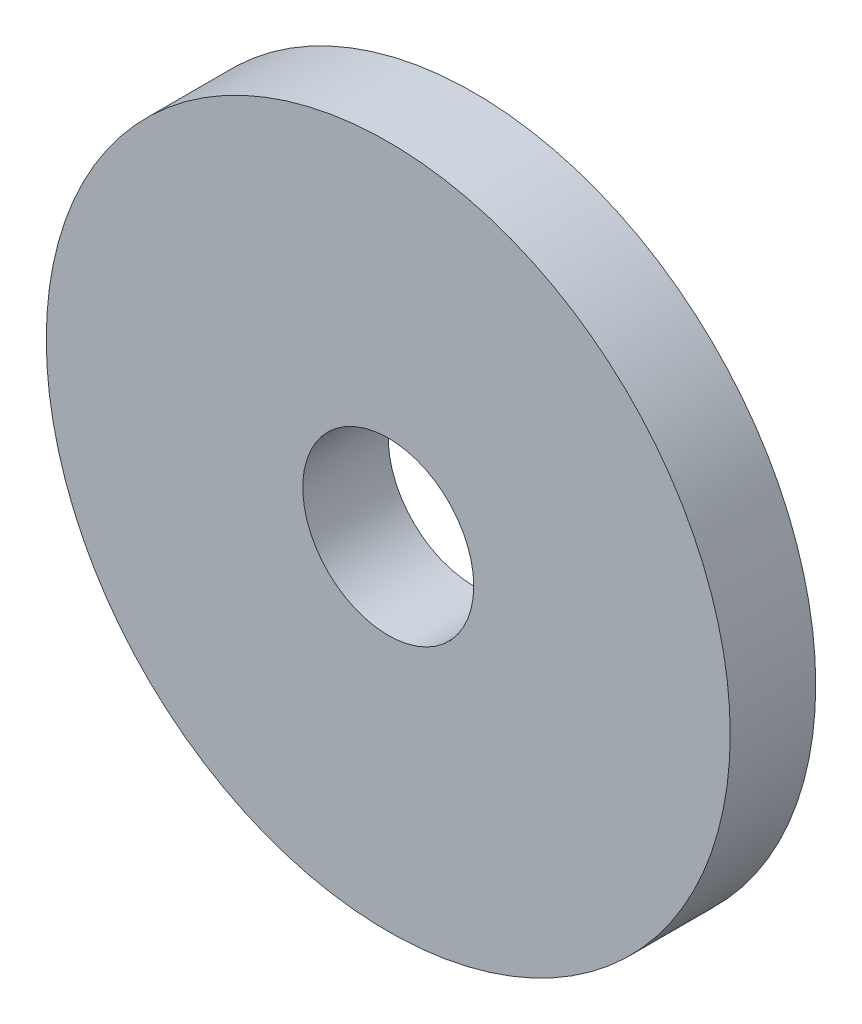
ISO-10303-21;
HEADER;
FILE_DESCRIPTION(('STEP AP214'),'2;1');
FILE_NAME('part.step','',(''),(''),'','','');
FILE_SCHEMA(('AUTOMOTIVE_DESIGN { 1 0 10303 214 1 1 1 1 }'));
ENDSEC;
DATA;
#1=APPLICATION_CONTEXT('core data for automotive mechanical design processes');
#2=APPLICATION_PROTOCOL_DEFINITION('international standard','automotive_design',2000,#1);
#3=PRODUCT_CONTEXT('',#1,'mechanical');
#4=PRODUCT('Part','Part','',(#3));
#5=PRODUCT_RELATED_PRODUCT_CATEGORY('part','',(#4));
#6=PRODUCT_DEFINITION_FORMATION('','',#4);
#7=PRODUCT_DEFINITION_CONTEXT('part definition',#1,'design');
#8=PRODUCT_DEFINITION('design','',#6,#7);
#9=PRODUCT_DEFINITION_SHAPE('','',#8);
#10=(LENGTH_UNIT() NAMED_UNIT(*) SI_UNIT(.MILLI.,.METRE.));
#11=(NAMED_UNIT(*) PLANE_ANGLE_UNIT() SI_UNIT($,.RADIAN.));
#12=(NAMED_UNIT(*) SI_UNIT($,.STERADIAN.) SOLID_ANGLE_UNIT());
#13=UNCERTAINTY_MEASURE_WITH_UNIT(LENGTH_MEASURE(1.E-05),#10,'distance_accuracy_value','');
#14=(GEOMETRIC_REPRESENTATION_CONTEXT(3) GLOBAL_UNCERTAINTY_ASSIGNED_CONTEXT((#13)) GLOBAL_UNIT_ASSIGNED_CONTEXT((#10,
#11,#12)) REPRESENTATION_CONTEXT('',''));
#15=CARTESIAN_POINT('',(0.,0.,0.));
#16=DIRECTION('',(0.,0.,1.));
#17=DIRECTION('',(1.,0.,0.));
#18=AXIS2_PLACEMENT_3D('',#15,#16,#17);
#19=CARTESIAN_POINT('',(0.,0.,5.));
#20=DIRECTION('',(0.,0.,-1.));
#21=DIRECTION('',(-1.,0.,0.));
#22=AXIS2_PLACEMENT_3D('',#19,#20,#21);
#23=CYLINDRICAL_SURFACE('',#22,20.);
#24=CARTESIAN_POINT('',(0.,0.,5.));
#25=DIRECTION('',(0.,0.,1.));
#26=DIRECTION('',(1.,0.,0.));
#27=AXIS2_PLACEMENT_3D('',#24,#25,#26);
#28=CIRCLE('',#27,20.);
#29=CARTESIAN_POINT('',(20.,0.,5.));
#30=VERTEX_POINT('',#29);
#31=EDGE_CURVE('E10',#30,#30,#28,.T.);
#32=ORIENTED_EDGE('',*,*,#31,.F.);
#33=EDGE_LOOP('',(#32));
#34=FACE_BOUND('',#33,.T.);
#35=CARTESIAN_POINT('',(0.,0.,0.));
#36=DIRECTION('',(0.,0.,1.));
#37=DIRECTION('',(1.,0.,0.));
#38=AXIS2_PLACEMENT_3D('',#35,#36,#37);
#39=CIRCLE('',#38,20.);
#40=CARTESIAN_POINT('',(20.,0.,0.));
#41=VERTEX_POINT('',#40);
#42=EDGE_CURVE('E36',#41,#41,#39,.T.);
#43=ORIENTED_EDGE('',*,*,#42,.T.);
#44=EDGE_LOOP('',(#43));
#45=FACE_BOUND('',#44,.T.);
#46=ADVANCED_FACE('F33',(#34,#45),#23,.T.);
#47=CARTESIAN_POINT('',(0.,0.,5.));
#48=DIRECTION('',(0.,0.,1.));
#49=DIRECTION('',(1.,0.,0.));
#50=AXIS2_PLACEMENT_3D('',#47,#48,#49);
#51=PLANE('',#50);
#52=CARTESIAN_POINT('',(0.,0.,5.));
#53=DIRECTION('',(0.,0.,1.));
#54=DIRECTION('',(1.,0.,0.));
#55=AXIS2_PLACEMENT_3D('',#52,#53,#54);
#56=CIRCLE('',#55,5.);
#57=CARTESIAN_POINT('',(5.,0.,5.));
#58=VERTEX_POINT('',#57);
#59=EDGE_CURVE('E47',#58,#58,#56,.T.);
#60=ORIENTED_EDGE('',*,*,#59,.F.);
#61=EDGE_LOOP('',(#60));
#62=FACE_BOUND('',#61,.T.);
#63=ORIENTED_EDGE('',*,*,#31,.T.);
#64=EDGE_LOOP('',(#63));
#65=FACE_BOUND('',#64,.T.);
#66=ADVANCED_FACE('F53',(#62,#65),#51,.T.);
#67=CARTESIAN_POINT('',(0.,0.,0.));
#68=DIRECTION('',(0.,0.,1.));
#69=DIRECTION('',(1.,0.,0.));
#70=AXIS2_PLACEMENT_3D('',#67,#68,#69);
#71=PLANE('',#70);
#72=CARTESIAN_POINT('',(0.,0.,0.));
#73=DIRECTION('',(0.,0.,1.));
#74=DIRECTION('',(1.,0.,0.));
#75=AXIS2_PLACEMENT_3D('',#72,#73,#74);
#76=CIRCLE('',#75,5.);
#77=CARTESIAN_POINT('',(5.,0.,0.));
#78=VERTEX_POINT('',#77);
#79=EDGE_CURVE('E43',#78,#78,#76,.F.);
#80=ORIENTED_EDGE('',*,*,#79,.F.);
#81=EDGE_LOOP('',(#80));
#82=FACE_BOUND('',#81,.T.);
#83=ORIENTED_EDGE('',*,*,#42,.F.);
#84=EDGE_LOOP('',(#83));
#85=FACE_BOUND('',#84,.T.);
#86=ADVANCED_FACE('F55',(#82,#85),#71,.F.);
#87=CARTESIAN_POINT('',(0.,0.,-14.1421356237309));
#88=DIRECTION('',(0.,0.,1.));
#89=DIRECTION('',(1.,0.,0.));
#90=AXIS2_PLACEMENT_3D('',#87,#88,#89);
#91=CYLINDRICAL_SURFACE('',#90,5.);
#92=ORIENTED_EDGE('',*,*,#79,.T.);
#93=EDGE_LOOP('',(#92));
#94=FACE_BOUND('',#93,.T.);
#95=ORIENTED_EDGE('',*,*,#59,.T.);
#96=EDGE_LOOP('',(#95));
#97=FACE_BOUND('',#96,.T.);
#98=ADVANCED_FACE('F51',(#94,#97),#91,.F.);
#99=CLOSED_SHELL('',(#46,#66,#86,#98));
#100=MANIFOLD_SOLID_BREP('B2',#99);
#101=ADVANCED_BREP_SHAPE_REPRESENTATION('',(#18,#100),#14);
#102=SHAPE_DEFINITION_REPRESENTATION(#9,#101);
ENDSEC;
END-ISO-10303-21;
